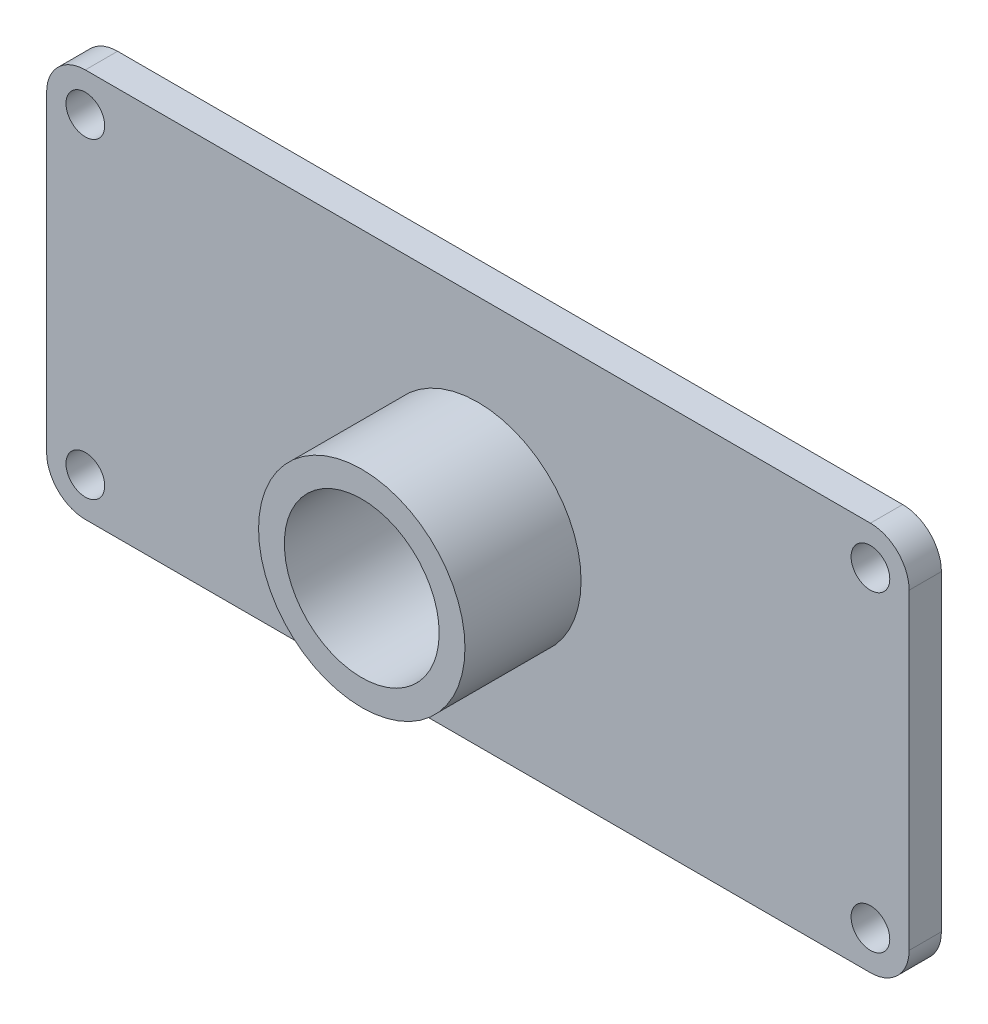
ISO-10303-21;
HEADER;
FILE_DESCRIPTION(('STEP AP214'),'2;1');
FILE_NAME('part.step','',(''),(''),'','','');
FILE_SCHEMA(('AUTOMOTIVE_DESIGN { 1 0 10303 214 1 1 1 1 }'));
ENDSEC;
DATA;
#1=APPLICATION_CONTEXT('core data for automotive mechanical design processes');
#2=APPLICATION_PROTOCOL_DEFINITION('international standard','automotive_design',2000,#1);
#3=PRODUCT_CONTEXT('',#1,'mechanical');
#4=PRODUCT('Part','Part','',(#3));
#5=PRODUCT_RELATED_PRODUCT_CATEGORY('part','',(#4));
#6=PRODUCT_DEFINITION_FORMATION('','',#4);
#7=PRODUCT_DEFINITION_CONTEXT('part definition',#1,'design');
#8=PRODUCT_DEFINITION('design','',#6,#7);
#9=PRODUCT_DEFINITION_SHAPE('','',#8);
#10=(LENGTH_UNIT() NAMED_UNIT(*) SI_UNIT(.MILLI.,.METRE.));
#11=(NAMED_UNIT(*) PLANE_ANGLE_UNIT() SI_UNIT($,.RADIAN.));
#12=(NAMED_UNIT(*) SI_UNIT($,.STERADIAN.) SOLID_ANGLE_UNIT());
#13=UNCERTAINTY_MEASURE_WITH_UNIT(LENGTH_MEASURE(1.E-05),#10,'distance_accuracy_value','');
#14=(GEOMETRIC_REPRESENTATION_CONTEXT(3) GLOBAL_UNCERTAINTY_ASSIGNED_CONTEXT((#13)) GLOBAL_UNIT_ASSIGNED_CONTEXT((#10,
#11,#12)) REPRESENTATION_CONTEXT('',''));
#15=CARTESIAN_POINT('',(0.,0.,0.));
#16=DIRECTION('',(0.,0.,1.));
#17=DIRECTION('',(1.,0.,0.));
#18=AXIS2_PLACEMENT_3D('',#15,#16,#17);
#19=CARTESIAN_POINT('',(61568.986707958,-75407.4891962118,5000.));
#20=DIRECTION('',(0.,0.,1.));
#21=DIRECTION('',(1.,0.,0.));
#22=AXIS2_PLACEMENT_3D('',#19,#20,#21);
#23=PLANE('',#22);
#24=CARTESIAN_POINT('',(122421.568981876,-51229.1485640785,5000.));
#25=DIRECTION('',(0.,0.,1.));
#26=DIRECTION('',(1.,0.,0.));
#27=AXIS2_PLACEMENT_3D('',#24,#25,#26);
#28=CIRCLE('',#27,16000.);
#29=CARTESIAN_POINT('',(138421.568981876,-51229.1485640785,5000.));
#30=VERTEX_POINT('',#29);
#31=EDGE_CURVE('E12',#30,#30,#28,.T.);
#32=ORIENTED_EDGE('',*,*,#31,.F.);
#33=EDGE_LOOP('',(#32));
#34=FACE_BOUND('',#33,.T.);
#35=CARTESIAN_POINT('',(183274.151255793,-27050.8079319453,5000.));
#36=DIRECTION('',(0.,0.,1.));
#37=DIRECTION('',(1.,0.,0.));
#38=AXIS2_PLACEMENT_3D('',#35,#36,#37);
#39=CIRCLE('',#38,2999.99999999999);
#40=CARTESIAN_POINT('',(186274.151255793,-27050.8079319453,5000.));
#41=VERTEX_POINT('',#40);
#42=EDGE_CURVE('E336',#41,#41,#39,.T.);
#43=ORIENTED_EDGE('',*,*,#42,.F.);
#44=EDGE_LOOP('',(#43));
#45=FACE_BOUND('',#44,.T.);
#46=CARTESIAN_POINT('',(61568.986707958,-27050.8079319453,5000.));
#47=DIRECTION('',(0.,0.,1.));
#48=DIRECTION('',(1.,0.,0.));
#49=AXIS2_PLACEMENT_3D('',#46,#47,#48);
#50=CIRCLE('',#49,3000.00000000001);
#51=CARTESIAN_POINT('',(64568.986707958,-27050.8079319453,5000.));
#52=VERTEX_POINT('',#51);
#53=EDGE_CURVE('E326',#52,#52,#50,.T.);
#54=ORIENTED_EDGE('',*,*,#53,.F.);
#55=EDGE_LOOP('',(#54));
#56=FACE_BOUND('',#55,.T.);
#57=DIRECTION('',(0.,-1.,0.));
#58=VECTOR('',#57,1.);
#59=CARTESIAN_POINT('',(55568.986707958,-27050.8079319453,5000.));
#60=LINE('',#59,#58);
#61=CARTESIAN_POINT('',(55568.986707958,-27050.8079319453,5000.));
#62=VERTEX_POINT('',#61);
#63=CARTESIAN_POINT('',(55568.986707958,-75407.4891962117,5000.));
#64=VERTEX_POINT('',#63);
#65=EDGE_CURVE('E287',#62,#64,#60,.T.);
#66=ORIENTED_EDGE('',*,*,#65,.T.);
#67=CARTESIAN_POINT('',(61568.986707958,-75407.4891962118,5000.));
#68=DIRECTION('',(0.,0.,1.));
#69=DIRECTION('',(1.,0.,0.));
#70=AXIS2_PLACEMENT_3D('',#67,#68,#69);
#71=CIRCLE('',#70,6000.);
#72=CARTESIAN_POINT('',(61568.9867079581,-81407.4891962118,5000.));
#73=VERTEX_POINT('',#72);
#74=EDGE_CURVE('E235',#64,#73,#71,.T.);
#75=ORIENTED_EDGE('',*,*,#74,.T.);
#76=DIRECTION('',(1.,0.,0.));
#77=VECTOR('',#76,1.);
#78=CARTESIAN_POINT('',(61568.9867079581,-81407.4891962118,5000.));
#79=LINE('',#78,#77);
#80=CARTESIAN_POINT('',(183274.151255793,-81407.4891962118,5000.));
#81=VERTEX_POINT('',#80);
#82=EDGE_CURVE('E318',#73,#81,#79,.T.);
#83=ORIENTED_EDGE('',*,*,#82,.T.);
#84=CARTESIAN_POINT('',(183274.151255793,-75407.4891962118,5000.));
#85=DIRECTION('',(0.,0.,1.));
#86=DIRECTION('',(1.,0.,0.));
#87=AXIS2_PLACEMENT_3D('',#84,#85,#86);
#88=CIRCLE('',#87,6000.);
#89=CARTESIAN_POINT('',(189274.151255793,-75407.4891962118,5000.));
#90=VERTEX_POINT('',#89);
#91=EDGE_CURVE('E320',#81,#90,#88,.T.);
#92=ORIENTED_EDGE('',*,*,#91,.T.);
#93=DIRECTION('',(0.,-1.,0.));
#94=VECTOR('',#93,1.);
#95=CARTESIAN_POINT('',(189274.151255793,-27050.8079319453,5000.));
#96=LINE('',#95,#94);
#97=CARTESIAN_POINT('',(189274.151255793,-27050.8079319453,5000.));
#98=VERTEX_POINT('',#97);
#99=EDGE_CURVE('E263',#98,#90,#96,.T.);
#100=ORIENTED_EDGE('',*,*,#99,.F.);
#101=CARTESIAN_POINT('',(183274.151255793,-27050.8079319453,5000.));
#102=DIRECTION('',(0.,0.,-1.));
#103=DIRECTION('',(-1.,0.,0.));
#104=AXIS2_PLACEMENT_3D('',#101,#102,#103);
#105=CIRCLE('',#104,6000.);
#106=CARTESIAN_POINT('',(183274.151255793,-21050.8079319453,5000.));
#107=VERTEX_POINT('',#106);
#108=EDGE_CURVE('E249',#107,#98,#105,.T.);
#109=ORIENTED_EDGE('',*,*,#108,.F.);
#110=DIRECTION('',(1.,0.,0.));
#111=VECTOR('',#110,1.);
#112=CARTESIAN_POINT('',(61568.986707958,-21050.8079319453,5000.));
#113=LINE('',#112,#111);
#114=CARTESIAN_POINT('',(61568.986707958,-21050.8079319453,5000.));
#115=VERTEX_POINT('',#114);
#116=EDGE_CURVE('E261',#115,#107,#113,.T.);
#117=ORIENTED_EDGE('',*,*,#116,.F.);
#118=CARTESIAN_POINT('',(61568.986707958,-27050.8079319453,5000.));
#119=DIRECTION('',(0.,0.,1.));
#120=DIRECTION('',(1.,0.,0.));
#121=AXIS2_PLACEMENT_3D('',#118,#119,#120);
#122=CIRCLE('',#121,6000.);
#123=EDGE_CURVE('E195',#115,#62,#122,.T.);
#124=ORIENTED_EDGE('',*,*,#123,.T.);
#125=EDGE_LOOP('',(#66,#75,#83,#92,#100,#109,#117,#124));
#126=FACE_BOUND('',#125,.T.);
#127=CARTESIAN_POINT('',(61568.986707958,-75407.4891962118,5000.));
#128=DIRECTION('',(0.,0.,1.));
#129=DIRECTION('',(1.,0.,0.));
#130=AXIS2_PLACEMENT_3D('',#127,#128,#129);
#131=CIRCLE('',#130,3000.);
#132=CARTESIAN_POINT('',(64568.986707958,-75407.4891962118,5000.));
#133=VERTEX_POINT('',#132);
#134=EDGE_CURVE('E329',#133,#133,#131,.T.);
#135=ORIENTED_EDGE('',*,*,#134,.F.);
#136=EDGE_LOOP('',(#135));
#137=FACE_BOUND('',#136,.T.);
#138=CARTESIAN_POINT('',(183274.151255793,-75407.4891962118,5000.));
#139=DIRECTION('',(0.,0.,1.));
#140=DIRECTION('',(1.,0.,0.));
#141=AXIS2_PLACEMENT_3D('',#138,#139,#140);
#142=CIRCLE('',#141,2999.99999999999);
#143=CARTESIAN_POINT('',(186274.151255793,-75407.4891962118,5000.));
#144=VERTEX_POINT('',#143);
#145=EDGE_CURVE('E345',#144,#144,#142,.T.);
#146=ORIENTED_EDGE('',*,*,#145,.F.);
#147=EDGE_LOOP('',(#146));
#148=FACE_BOUND('',#147,.T.);
#149=ADVANCED_FACE('F173',(#34,#45,#56,#126,#137,#148),#23,.T.);
#150=CARTESIAN_POINT('',(61568.986707958,-75407.4891962118,0.));
#151=DIRECTION('',(0.,0.,1.));
#152=DIRECTION('',(1.,0.,0.));
#153=AXIS2_PLACEMENT_3D('',#150,#151,#152);
#154=PLANE('',#153);
#155=DIRECTION('',(0.,-1.,0.));
#156=VECTOR('',#155,1.);
#157=CARTESIAN_POINT('',(55568.986707958,-27050.8079319453,0.));
#158=LINE('',#157,#156);
#159=CARTESIAN_POINT('',(55568.986707958,-27050.8079319453,0.));
#160=VERTEX_POINT('',#159);
#161=CARTESIAN_POINT('',(55568.986707958,-75407.4891962117,0.));
#162=VERTEX_POINT('',#161);
#163=EDGE_CURVE('E271',#160,#162,#158,.T.);
#164=ORIENTED_EDGE('',*,*,#163,.F.);
#165=CARTESIAN_POINT('',(61568.986707958,-27050.8079319453,0.));
#166=DIRECTION('',(0.,0.,1.));
#167=DIRECTION('',(1.,0.,0.));
#168=AXIS2_PLACEMENT_3D('',#165,#166,#167);
#169=CIRCLE('',#168,6000.);
#170=CARTESIAN_POINT('',(61568.986707958,-21050.8079319453,0.));
#171=VERTEX_POINT('',#170);
#172=EDGE_CURVE('E224',#171,#160,#169,.T.);
#173=ORIENTED_EDGE('',*,*,#172,.F.);
#174=DIRECTION('',(1.,0.,0.));
#175=VECTOR('',#174,1.);
#176=CARTESIAN_POINT('',(61568.986707958,-21050.8079319453,0.));
#177=LINE('',#176,#175);
#178=CARTESIAN_POINT('',(183274.151255793,-21050.8079319453,0.));
#179=VERTEX_POINT('',#178);
#180=EDGE_CURVE('E286',#171,#179,#177,.T.);
#181=ORIENTED_EDGE('',*,*,#180,.T.);
#182=CARTESIAN_POINT('',(183274.151255793,-27050.8079319453,0.));
#183=DIRECTION('',(0.,0.,-1.));
#184=DIRECTION('',(-1.,0.,0.));
#185=AXIS2_PLACEMENT_3D('',#182,#183,#184);
#186=CIRCLE('',#185,6000.);
#187=CARTESIAN_POINT('',(189274.151255793,-27050.8079319453,0.));
#188=VERTEX_POINT('',#187);
#189=EDGE_CURVE('E252',#179,#188,#186,.T.);
#190=ORIENTED_EDGE('',*,*,#189,.T.);
#191=DIRECTION('',(0.,-1.,0.));
#192=VECTOR('',#191,1.);
#193=CARTESIAN_POINT('',(189274.151255793,-27050.8079319453,0.));
#194=LINE('',#193,#192);
#195=CARTESIAN_POINT('',(189274.151255793,-75407.4891962118,0.));
#196=VERTEX_POINT('',#195);
#197=EDGE_CURVE('E282',#188,#196,#194,.T.);
#198=ORIENTED_EDGE('',*,*,#197,.T.);
#199=CARTESIAN_POINT('',(183274.151255793,-75407.4891962118,0.));
#200=DIRECTION('',(0.,0.,1.));
#201=DIRECTION('',(1.,0.,0.));
#202=AXIS2_PLACEMENT_3D('',#199,#200,#201);
#203=CIRCLE('',#202,6000.);
#204=CARTESIAN_POINT('',(183274.151255793,-81407.4891962118,0.));
#205=VERTEX_POINT('',#204);
#206=EDGE_CURVE('E276',#205,#196,#203,.T.);
#207=ORIENTED_EDGE('',*,*,#206,.F.);
#208=DIRECTION('',(1.,0.,0.));
#209=VECTOR('',#208,1.);
#210=CARTESIAN_POINT('',(61568.9867079581,-81407.4891962118,0.));
#211=LINE('',#210,#209);
#212=CARTESIAN_POINT('',(61568.9867079581,-81407.4891962118,0.));
#213=VERTEX_POINT('',#212);
#214=EDGE_CURVE('E280',#213,#205,#211,.T.);
#215=ORIENTED_EDGE('',*,*,#214,.F.);
#216=CARTESIAN_POINT('',(61568.986707958,-75407.4891962118,0.));
#217=DIRECTION('',(0.,0.,1.));
#218=DIRECTION('',(1.,0.,0.));
#219=AXIS2_PLACEMENT_3D('',#216,#217,#218);
#220=CIRCLE('',#219,6000.);
#221=EDGE_CURVE('E273',#162,#213,#220,.T.);
#222=ORIENTED_EDGE('',*,*,#221,.F.);
#223=EDGE_LOOP('',(#164,#173,#181,#190,#198,#207,#215,#222));
#224=FACE_BOUND('',#223,.T.);
#225=CARTESIAN_POINT('',(122421.568981876,-51229.1485640785,0.));
#226=DIRECTION('',(0.,0.,1.));
#227=DIRECTION('',(1.,0.,0.));
#228=AXIS2_PLACEMENT_3D('',#225,#226,#227);
#229=CIRCLE('',#228,12000.);
#230=CARTESIAN_POINT('',(134421.568981876,-51229.1485640785,0.));
#231=VERTEX_POINT('',#230);
#232=EDGE_CURVE('E274',#231,#231,#229,.T.);
#233=ORIENTED_EDGE('',*,*,#232,.T.);
#234=EDGE_LOOP('',(#233));
#235=FACE_BOUND('',#234,.T.);
#236=CARTESIAN_POINT('',(61568.986707958,-27050.8079319453,0.));
#237=DIRECTION('',(0.,0.,1.));
#238=DIRECTION('',(1.,0.,0.));
#239=AXIS2_PLACEMENT_3D('',#236,#237,#238);
#240=CIRCLE('',#239,3000.00000000001);
#241=CARTESIAN_POINT('',(64568.986707958,-27050.8079319453,0.));
#242=VERTEX_POINT('',#241);
#243=EDGE_CURVE('E330',#242,#242,#240,.T.);
#244=ORIENTED_EDGE('',*,*,#243,.T.);
#245=EDGE_LOOP('',(#244));
#246=FACE_BOUND('',#245,.T.);
#247=CARTESIAN_POINT('',(61568.986707958,-75407.4891962118,0.));
#248=DIRECTION('',(0.,0.,1.));
#249=DIRECTION('',(1.,0.,0.));
#250=AXIS2_PLACEMENT_3D('',#247,#248,#249);
#251=CIRCLE('',#250,3000.);
#252=CARTESIAN_POINT('',(64568.986707958,-75407.4891962118,0.));
#253=VERTEX_POINT('',#252);
#254=EDGE_CURVE('E334',#253,#253,#251,.T.);
#255=ORIENTED_EDGE('',*,*,#254,.T.);
#256=EDGE_LOOP('',(#255));
#257=FACE_BOUND('',#256,.T.);
#258=CARTESIAN_POINT('',(183274.151255793,-27050.8079319453,0.));
#259=DIRECTION('',(0.,0.,1.));
#260=DIRECTION('',(1.,0.,0.));
#261=AXIS2_PLACEMENT_3D('',#258,#259,#260);
#262=CIRCLE('',#261,2999.99999999999);
#263=CARTESIAN_POINT('',(186274.151255793,-27050.8079319453,0.));
#264=VERTEX_POINT('',#263);
#265=EDGE_CURVE('E338',#264,#264,#262,.T.);
#266=ORIENTED_EDGE('',*,*,#265,.T.);
#267=EDGE_LOOP('',(#266));
#268=FACE_BOUND('',#267,.T.);
#269=CARTESIAN_POINT('',(183274.151255793,-75407.4891962118,0.));
#270=DIRECTION('',(0.,0.,1.));
#271=DIRECTION('',(1.,0.,0.));
#272=AXIS2_PLACEMENT_3D('',#269,#270,#271);
#273=CIRCLE('',#272,2999.99999999999);
#274=CARTESIAN_POINT('',(186274.151255793,-75407.4891962118,0.));
#275=VERTEX_POINT('',#274);
#276=EDGE_CURVE('E344',#275,#275,#273,.T.);
#277=ORIENTED_EDGE('',*,*,#276,.T.);
#278=EDGE_LOOP('',(#277));
#279=FACE_BOUND('',#278,.T.);
#280=ADVANCED_FACE('F306',(#224,#235,#246,#257,#268,#279),#154,.F.);
#281=CARTESIAN_POINT('',(55568.986707958,-27050.8079319453,5000.));
#282=DIRECTION('',(1.,0.,0.));
#283=DIRECTION('',(0.,1.,0.));
#284=AXIS2_PLACEMENT_3D('',#281,#282,#283);
#285=PLANE('',#284);
#286=ORIENTED_EDGE('',*,*,#163,.T.);
#287=DIRECTION('',(0.,0.,-1.));
#288=VECTOR('',#287,1.);
#289=CARTESIAN_POINT('',(55568.986707958,-75407.4891962117,5000.));
#290=LINE('',#289,#288);
#291=EDGE_CURVE('E178',#64,#162,#290,.T.);
#292=ORIENTED_EDGE('',*,*,#291,.F.);
#293=ORIENTED_EDGE('',*,*,#65,.F.);
#294=DIRECTION('',(0.,0.,-1.));
#295=VECTOR('',#294,1.);
#296=CARTESIAN_POINT('',(55568.986707958,-27050.8079319453,5000.));
#297=LINE('',#296,#295);
#298=EDGE_CURVE('E270',#62,#160,#297,.T.);
#299=ORIENTED_EDGE('',*,*,#298,.T.);
#300=EDGE_LOOP('',(#286,#292,#293,#299));
#301=FACE_BOUND('',#300,.T.);
#302=ADVANCED_FACE('F176',(#301),#285,.F.);
#303=CARTESIAN_POINT('',(61568.986707958,-75407.4891962118,5000.));
#304=DIRECTION('',(0.,0.,-1.));
#305=DIRECTION('',(-1.,0.,0.));
#306=AXIS2_PLACEMENT_3D('',#303,#304,#305);
#307=CYLINDRICAL_SURFACE('',#306,6000.);
#308=ORIENTED_EDGE('',*,*,#221,.T.);
#309=DIRECTION('',(0.,0.,-1.));
#310=VECTOR('',#309,1.);
#311=CARTESIAN_POINT('',(61568.9867079581,-81407.4891962118,5000.));
#312=LINE('',#311,#310);
#313=EDGE_CURVE('E300',#73,#213,#312,.T.);
#314=ORIENTED_EDGE('',*,*,#313,.F.);
#315=ORIENTED_EDGE('',*,*,#74,.F.);
#316=ORIENTED_EDGE('',*,*,#291,.T.);
#317=EDGE_LOOP('',(#308,#314,#315,#316));
#318=FACE_BOUND('',#317,.T.);
#319=ADVANCED_FACE('F303',(#318),#307,.T.);
#320=CARTESIAN_POINT('',(61568.9867079581,-81407.4891962118,5000.));
#321=DIRECTION('',(0.,1.,0.));
#322=DIRECTION('',(0.,0.,1.));
#323=AXIS2_PLACEMENT_3D('',#320,#321,#322);
#324=PLANE('',#323);
#325=ORIENTED_EDGE('',*,*,#214,.T.);
#326=DIRECTION('',(0.,0.,-1.));
#327=VECTOR('',#326,1.);
#328=CARTESIAN_POINT('',(183274.151255793,-81407.4891962118,5000.));
#329=LINE('',#328,#327);
#330=EDGE_CURVE('E293',#81,#205,#329,.T.);
#331=ORIENTED_EDGE('',*,*,#330,.F.);
#332=ORIENTED_EDGE('',*,*,#82,.F.);
#333=ORIENTED_EDGE('',*,*,#313,.T.);
#334=EDGE_LOOP('',(#325,#331,#332,#333));
#335=FACE_BOUND('',#334,.T.);
#336=ADVANCED_FACE('F315',(#335),#324,.F.);
#337=CARTESIAN_POINT('',(183274.151255793,-75407.4891962118,5000.));
#338=DIRECTION('',(0.,0.,-1.));
#339=DIRECTION('',(-1.,0.,0.));
#340=AXIS2_PLACEMENT_3D('',#337,#338,#339);
#341=CYLINDRICAL_SURFACE('',#340,6000.);
#342=ORIENTED_EDGE('',*,*,#206,.T.);
#343=DIRECTION('',(0.,0.,-1.));
#344=VECTOR('',#343,1.);
#345=CARTESIAN_POINT('',(189274.151255793,-75407.4891962118,5000.));
#346=LINE('',#345,#344);
#347=EDGE_CURVE('E291',#90,#196,#346,.T.);
#348=ORIENTED_EDGE('',*,*,#347,.F.);
#349=ORIENTED_EDGE('',*,*,#91,.F.);
#350=ORIENTED_EDGE('',*,*,#330,.T.);
#351=EDGE_LOOP('',(#342,#348,#349,#350));
#352=FACE_BOUND('',#351,.T.);
#353=ADVANCED_FACE('F312',(#352),#341,.T.);
#354=CARTESIAN_POINT('',(189274.151255793,-27050.8079319453,5000.));
#355=DIRECTION('',(1.,0.,0.));
#356=DIRECTION('',(0.,0.,-1.));
#357=AXIS2_PLACEMENT_3D('',#354,#355,#356);
#358=PLANE('',#357);
#359=ORIENTED_EDGE('',*,*,#197,.F.);
#360=DIRECTION('',(0.,0.,-1.));
#361=VECTOR('',#360,1.);
#362=CARTESIAN_POINT('',(189274.151255793,-27050.8079319453,5000.));
#363=LINE('',#362,#361);
#364=EDGE_CURVE('E260',#98,#188,#363,.T.);
#365=ORIENTED_EDGE('',*,*,#364,.F.);
#366=ORIENTED_EDGE('',*,*,#99,.T.);
#367=ORIENTED_EDGE('',*,*,#347,.T.);
#368=EDGE_LOOP('',(#359,#365,#366,#367));
#369=FACE_BOUND('',#368,.T.);
#370=ADVANCED_FACE('F393',(#369),#358,.T.);
#371=CARTESIAN_POINT('',(183274.151255793,-27050.8079319453,5000.));
#372=DIRECTION('',(0.,0.,-1.));
#373=DIRECTION('',(-1.,0.,0.));
#374=AXIS2_PLACEMENT_3D('',#371,#372,#373);
#375=CYLINDRICAL_SURFACE('',#374,6000.);
#376=ORIENTED_EDGE('',*,*,#189,.F.);
#377=DIRECTION('',(0.,0.,-1.));
#378=VECTOR('',#377,1.);
#379=CARTESIAN_POINT('',(183274.151255793,-21050.8079319453,5000.));
#380=LINE('',#379,#378);
#381=EDGE_CURVE('E250',#107,#179,#380,.T.);
#382=ORIENTED_EDGE('',*,*,#381,.F.);
#383=ORIENTED_EDGE('',*,*,#108,.T.);
#384=ORIENTED_EDGE('',*,*,#364,.T.);
#385=EDGE_LOOP('',(#376,#382,#383,#384));
#386=FACE_BOUND('',#385,.T.);
#387=ADVANCED_FACE('F247',(#386),#375,.T.);
#388=CARTESIAN_POINT('',(61568.986707958,-21050.8079319453,5000.));
#389=DIRECTION('',(0.,1.,0.));
#390=DIRECTION('',(0.,0.,1.));
#391=AXIS2_PLACEMENT_3D('',#388,#389,#390);
#392=PLANE('',#391);
#393=ORIENTED_EDGE('',*,*,#180,.F.);
#394=DIRECTION('',(0.,0.,-1.));
#395=VECTOR('',#394,1.);
#396=CARTESIAN_POINT('',(61568.986707958,-21050.8079319453,5000.));
#397=LINE('',#396,#395);
#398=EDGE_CURVE('E219',#115,#171,#397,.T.);
#399=ORIENTED_EDGE('',*,*,#398,.F.);
#400=ORIENTED_EDGE('',*,*,#116,.T.);
#401=ORIENTED_EDGE('',*,*,#381,.T.);
#402=EDGE_LOOP('',(#393,#399,#400,#401));
#403=FACE_BOUND('',#402,.T.);
#404=ADVANCED_FACE('F264',(#403),#392,.T.);
#405=CARTESIAN_POINT('',(61568.986707958,-27050.8079319453,5000.));
#406=DIRECTION('',(0.,0.,-1.));
#407=DIRECTION('',(-1.,0.,0.));
#408=AXIS2_PLACEMENT_3D('',#405,#406,#407);
#409=CYLINDRICAL_SURFACE('',#408,6000.);
#410=ORIENTED_EDGE('',*,*,#172,.T.);
#411=ORIENTED_EDGE('',*,*,#298,.F.);
#412=ORIENTED_EDGE('',*,*,#123,.F.);
#413=ORIENTED_EDGE('',*,*,#398,.T.);
#414=EDGE_LOOP('',(#410,#411,#412,#413));
#415=FACE_BOUND('',#414,.T.);
#416=ADVANCED_FACE('F390',(#415),#409,.T.);
#417=CARTESIAN_POINT('',(122421.568981876,-51229.1485640785,5000.));
#418=DIRECTION('',(0.,0.,-1.));
#419=DIRECTION('',(-1.,0.,0.));
#420=AXIS2_PLACEMENT_3D('',#417,#418,#419);
#421=CYLINDRICAL_SURFACE('',#420,12000.);
#422=ORIENTED_EDGE('',*,*,#232,.F.);
#423=EDGE_LOOP('',(#422));
#424=FACE_BOUND('',#423,.T.);
#425=CARTESIAN_POINT('',(122421.568981876,-51229.1485640785,23000.));
#426=DIRECTION('',(0.,0.,1.));
#427=DIRECTION('',(1.,0.,0.));
#428=AXIS2_PLACEMENT_3D('',#425,#426,#427);
#429=CIRCLE('',#428,12000.);
#430=CARTESIAN_POINT('',(134421.568981876,-51229.1485640785,23000.));
#431=VERTEX_POINT('',#430);
#432=EDGE_CURVE('E354',#431,#431,#429,.T.);
#433=ORIENTED_EDGE('',*,*,#432,.T.);
#434=EDGE_LOOP('',(#433));
#435=FACE_BOUND('',#434,.T.);
#436=ADVANCED_FACE('F360',(#424,#435),#421,.F.);
#437=CARTESIAN_POINT('',(61568.986707958,-27050.8079319453,5000.));
#438=DIRECTION('',(0.,0.,-1.));
#439=DIRECTION('',(-1.,0.,0.));
#440=AXIS2_PLACEMENT_3D('',#437,#438,#439);
#441=CYLINDRICAL_SURFACE('',#440,3000.00000000001);
#442=ORIENTED_EDGE('',*,*,#53,.T.);
#443=EDGE_LOOP('',(#442));
#444=FACE_BOUND('',#443,.T.);
#445=ORIENTED_EDGE('',*,*,#243,.F.);
#446=EDGE_LOOP('',(#445));
#447=FACE_BOUND('',#446,.T.);
#448=ADVANCED_FACE('F459',(#444,#447),#441,.F.);
#449=CARTESIAN_POINT('',(61568.986707958,-75407.4891962118,5000.));
#450=DIRECTION('',(0.,0.,-1.));
#451=DIRECTION('',(-1.,0.,0.));
#452=AXIS2_PLACEMENT_3D('',#449,#450,#451);
#453=CYLINDRICAL_SURFACE('',#452,3000.);
#454=ORIENTED_EDGE('',*,*,#134,.T.);
#455=EDGE_LOOP('',(#454));
#456=FACE_BOUND('',#455,.T.);
#457=ORIENTED_EDGE('',*,*,#254,.F.);
#458=EDGE_LOOP('',(#457));
#459=FACE_BOUND('',#458,.T.);
#460=ADVANCED_FACE('F468',(#456,#459),#453,.F.);
#461=CARTESIAN_POINT('',(183274.151255793,-27050.8079319453,5000.));
#462=DIRECTION('',(0.,0.,-1.));
#463=DIRECTION('',(-1.,0.,0.));
#464=AXIS2_PLACEMENT_3D('',#461,#462,#463);
#465=CYLINDRICAL_SURFACE('',#464,2999.99999999999);
#466=ORIENTED_EDGE('',*,*,#42,.T.);
#467=EDGE_LOOP('',(#466));
#468=FACE_BOUND('',#467,.T.);
#469=ORIENTED_EDGE('',*,*,#265,.F.);
#470=EDGE_LOOP('',(#469));
#471=FACE_BOUND('',#470,.T.);
#472=ADVANCED_FACE('F375',(#468,#471),#465,.F.);
#473=CARTESIAN_POINT('',(183274.151255793,-75407.4891962118,5000.));
#474=DIRECTION('',(0.,0.,-1.));
#475=DIRECTION('',(-1.,0.,0.));
#476=AXIS2_PLACEMENT_3D('',#473,#474,#475);
#477=CYLINDRICAL_SURFACE('',#476,2999.99999999999);
#478=ORIENTED_EDGE('',*,*,#145,.T.);
#479=EDGE_LOOP('',(#478));
#480=FACE_BOUND('',#479,.T.);
#481=ORIENTED_EDGE('',*,*,#276,.F.);
#482=EDGE_LOOP('',(#481));
#483=FACE_BOUND('',#482,.T.);
#484=ADVANCED_FACE('F362',(#480,#483),#477,.F.);
#485=CARTESIAN_POINT('',(122421.568981876,-51229.1485640785,23000.));
#486=DIRECTION('',(0.,0.,1.));
#487=DIRECTION('',(1.,0.,0.));
#488=AXIS2_PLACEMENT_3D('',#485,#486,#487);
#489=PLANE('',#488);
#490=CARTESIAN_POINT('',(122421.568981876,-51229.1485640785,23000.));
#491=DIRECTION('',(0.,0.,1.));
#492=DIRECTION('',(1.,0.,0.));
#493=AXIS2_PLACEMENT_3D('',#490,#491,#492);
#494=CIRCLE('',#493,16000.);
#495=CARTESIAN_POINT('',(138421.568981876,-51229.1485640785,23000.));
#496=VERTEX_POINT('',#495);
#497=EDGE_CURVE('E346',#496,#496,#494,.T.);
#498=ORIENTED_EDGE('',*,*,#497,.T.);
#499=EDGE_LOOP('',(#498));
#500=FACE_BOUND('',#499,.T.);
#501=ORIENTED_EDGE('',*,*,#432,.F.);
#502=EDGE_LOOP('',(#501));
#503=FACE_BOUND('',#502,.T.);
#504=ADVANCED_FACE('F357',(#500,#503),#489,.T.);
#505=CARTESIAN_POINT('',(122421.568981876,-51229.1485640785,23000.));
#506=DIRECTION('',(0.,0.,-1.));
#507=DIRECTION('',(-1.,0.,0.));
#508=AXIS2_PLACEMENT_3D('',#505,#506,#507);
#509=CYLINDRICAL_SURFACE('',#508,16000.);
#510=ORIENTED_EDGE('',*,*,#497,.F.);
#511=EDGE_LOOP('',(#510));
#512=FACE_BOUND('',#511,.T.);
#513=ORIENTED_EDGE('',*,*,#31,.T.);
#514=EDGE_LOOP('',(#513));
#515=FACE_BOUND('',#514,.T.);
#516=ADVANCED_FACE('F363',(#512,#515),#509,.T.);
#517=CLOSED_SHELL('',(#149,#280,#302,#319,#336,#353,#370,#387,#404,#416,#436,#448,#460,#472,
#484,#504,#516));
#518=MANIFOLD_SOLID_BREP('B2',#517);
#519=ADVANCED_BREP_SHAPE_REPRESENTATION('',(#18,#518),#14);
#520=SHAPE_DEFINITION_REPRESENTATION(#9,#519);
ENDSEC;
END-ISO-10303-21;
